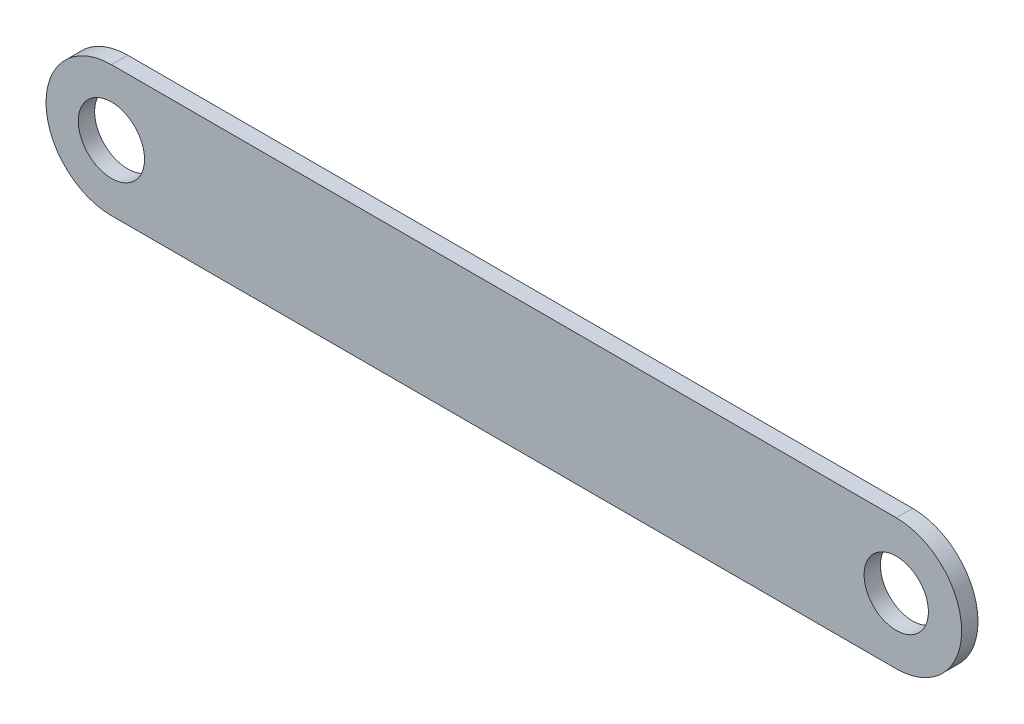
ISO-10303-21;
HEADER;
FILE_DESCRIPTION(('STEP AP214'),'2;1');
FILE_NAME('part.step','',(''),(''),'','','');
FILE_SCHEMA(('AUTOMOTIVE_DESIGN { 1 0 10303 214 1 1 1 1 }'));
ENDSEC;
DATA;
#1=APPLICATION_CONTEXT('core data for automotive mechanical design processes');
#2=APPLICATION_PROTOCOL_DEFINITION('international standard','automotive_design',2000,#1);
#3=PRODUCT_CONTEXT('',#1,'mechanical');
#4=PRODUCT('Part','Part','',(#3));
#5=PRODUCT_RELATED_PRODUCT_CATEGORY('part','',(#4));
#6=PRODUCT_DEFINITION_FORMATION('','',#4);
#7=PRODUCT_DEFINITION_CONTEXT('part definition',#1,'design');
#8=PRODUCT_DEFINITION('design','',#6,#7);
#9=PRODUCT_DEFINITION_SHAPE('','',#8);
#10=(LENGTH_UNIT() NAMED_UNIT(*) SI_UNIT(.MILLI.,.METRE.));
#11=(NAMED_UNIT(*) PLANE_ANGLE_UNIT() SI_UNIT($,.RADIAN.));
#12=(NAMED_UNIT(*) SI_UNIT($,.STERADIAN.) SOLID_ANGLE_UNIT());
#13=UNCERTAINTY_MEASURE_WITH_UNIT(LENGTH_MEASURE(1.E-05),#10,'distance_accuracy_value','');
#14=(GEOMETRIC_REPRESENTATION_CONTEXT(3) GLOBAL_UNCERTAINTY_ASSIGNED_CONTEXT((#13)) GLOBAL_UNIT_ASSIGNED_CONTEXT((#10,
#11,#12)) REPRESENTATION_CONTEXT('',''));
#15=CARTESIAN_POINT('',(0.,0.,0.));
#16=DIRECTION('',(0.,0.,1.));
#17=DIRECTION('',(1.,0.,0.));
#18=AXIS2_PLACEMENT_3D('',#15,#16,#17);
#19=CARTESIAN_POINT('',(0.,-12.7,3.175));
#20=DIRECTION('',(0.,1.,0.));
#21=DIRECTION('',(0.,0.,1.));
#22=AXIS2_PLACEMENT_3D('',#19,#20,#21);
#23=PLANE('',#22);
#24=DIRECTION('',(1.,0.,0.));
#25=VECTOR('',#24,1.);
#26=CARTESIAN_POINT('',(0.,-12.7,0.));
#27=LINE('',#26,#25);
#28=CARTESIAN_POINT('',(0.,-12.7,0.));
#29=VERTEX_POINT('',#28);
#30=CARTESIAN_POINT('',(152.4,-12.7,0.));
#31=VERTEX_POINT('',#30);
#32=EDGE_CURVE('E104',#29,#31,#27,.T.);
#33=ORIENTED_EDGE('',*,*,#32,.T.);
#34=DIRECTION('',(0.,0.,-1.));
#35=VECTOR('',#34,1.);
#36=CARTESIAN_POINT('',(152.4,-12.7,3.175));
#37=LINE('',#36,#35);
#38=CARTESIAN_POINT('',(152.4,-12.7,3.175));
#39=VERTEX_POINT('',#38);
#40=EDGE_CURVE('E11',#39,#31,#37,.T.);
#41=ORIENTED_EDGE('',*,*,#40,.F.);
#42=DIRECTION('',(1.,0.,0.));
#43=VECTOR('',#42,1.);
#44=CARTESIAN_POINT('',(0.,-12.7,3.175));
#45=LINE('',#44,#43);
#46=CARTESIAN_POINT('',(0.,-12.7,3.175));
#47=VERTEX_POINT('',#46);
#48=EDGE_CURVE('E83',#47,#39,#45,.T.);
#49=ORIENTED_EDGE('',*,*,#48,.F.);
#50=DIRECTION('',(0.,0.,-1.));
#51=VECTOR('',#50,1.);
#52=CARTESIAN_POINT('',(0.,-12.7,3.175));
#53=LINE('',#52,#51);
#54=EDGE_CURVE('E94',#47,#29,#53,.T.);
#55=ORIENTED_EDGE('',*,*,#54,.T.);
#56=EDGE_LOOP('',(#33,#41,#49,#55));
#57=FACE_BOUND('',#56,.T.);
#58=ADVANCED_FACE('F35',(#57),#23,.F.);
#59=CARTESIAN_POINT('',(152.4,0.,3.175));
#60=DIRECTION('',(0.,0.,-1.));
#61=DIRECTION('',(-1.,0.,0.));
#62=AXIS2_PLACEMENT_3D('',#59,#60,#61);
#63=CYLINDRICAL_SURFACE('',#62,12.7);
#64=CARTESIAN_POINT('',(152.4,0.,0.));
#65=DIRECTION('',(0.,0.,1.));
#66=DIRECTION('',(1.,0.,0.));
#67=AXIS2_PLACEMENT_3D('',#64,#65,#66);
#68=CIRCLE('',#67,12.7);
#69=CARTESIAN_POINT('',(152.4,12.7,0.));
#70=VERTEX_POINT('',#69);
#71=EDGE_CURVE('E88',#31,#70,#68,.T.);
#72=ORIENTED_EDGE('',*,*,#71,.T.);
#73=DIRECTION('',(0.,0.,-1.));
#74=VECTOR('',#73,1.);
#75=CARTESIAN_POINT('',(152.4,12.7,3.175));
#76=LINE('',#75,#74);
#77=CARTESIAN_POINT('',(152.4,12.7,3.175));
#78=VERTEX_POINT('',#77);
#79=EDGE_CURVE('E44',#78,#70,#76,.T.);
#80=ORIENTED_EDGE('',*,*,#79,.F.);
#81=CARTESIAN_POINT('',(152.4,0.,3.175));
#82=DIRECTION('',(0.,0.,1.));
#83=DIRECTION('',(1.,0.,0.));
#84=AXIS2_PLACEMENT_3D('',#81,#82,#83);
#85=CIRCLE('',#84,12.7);
#86=EDGE_CURVE('E78',#39,#78,#85,.T.);
#87=ORIENTED_EDGE('',*,*,#86,.F.);
#88=ORIENTED_EDGE('',*,*,#40,.T.);
#89=EDGE_LOOP('',(#72,#80,#87,#88));
#90=FACE_BOUND('',#89,.T.);
#91=ADVANCED_FACE('F87',(#90),#63,.T.);
#92=CARTESIAN_POINT('',(0.,12.7,3.175));
#93=DIRECTION('',(0.,1.,0.));
#94=DIRECTION('',(0.,0.,1.));
#95=AXIS2_PLACEMENT_3D('',#92,#93,#94);
#96=PLANE('',#95);
#97=DIRECTION('',(1.,0.,0.));
#98=VECTOR('',#97,1.);
#99=CARTESIAN_POINT('',(0.,12.7,0.));
#100=LINE('',#99,#98);
#101=CARTESIAN_POINT('',(0.,12.7,0.));
#102=VERTEX_POINT('',#101);
#103=EDGE_CURVE('E108',#102,#70,#100,.T.);
#104=ORIENTED_EDGE('',*,*,#103,.F.);
#105=DIRECTION('',(0.,0.,-1.));
#106=VECTOR('',#105,1.);
#107=CARTESIAN_POINT('',(0.,12.7,3.175));
#108=LINE('',#107,#106);
#109=CARTESIAN_POINT('',(0.,12.7,3.175));
#110=VERTEX_POINT('',#109);
#111=EDGE_CURVE('E68',#110,#102,#108,.T.);
#112=ORIENTED_EDGE('',*,*,#111,.F.);
#113=DIRECTION('',(1.,0.,0.));
#114=VECTOR('',#113,1.);
#115=CARTESIAN_POINT('',(0.,12.7,3.175));
#116=LINE('',#115,#114);
#117=EDGE_CURVE('E81',#110,#78,#116,.T.);
#118=ORIENTED_EDGE('',*,*,#117,.T.);
#119=ORIENTED_EDGE('',*,*,#79,.T.);
#120=EDGE_LOOP('',(#104,#112,#118,#119));
#121=FACE_BOUND('',#120,.T.);
#122=ADVANCED_FACE('F92',(#121),#96,.T.);
#123=CARTESIAN_POINT('',(0.,0.,3.175));
#124=DIRECTION('',(0.,0.,-1.));
#125=DIRECTION('',(-1.,0.,0.));
#126=AXIS2_PLACEMENT_3D('',#123,#124,#125);
#127=CYLINDRICAL_SURFACE('',#126,6.43006976920332);
#128=CARTESIAN_POINT('',(0.,0.,3.175));
#129=DIRECTION('',(0.,0.,1.));
#130=DIRECTION('',(1.,0.,0.));
#131=AXIS2_PLACEMENT_3D('',#128,#129,#130);
#132=CIRCLE('',#131,6.43006976920332);
#133=CARTESIAN_POINT('',(6.43006976920332,0.,3.175));
#134=VERTEX_POINT('',#133);
#135=EDGE_CURVE('E146',#134,#134,#132,.T.);
#136=ORIENTED_EDGE('',*,*,#135,.T.);
#137=EDGE_LOOP('',(#136));
#138=FACE_BOUND('',#137,.T.);
#139=CARTESIAN_POINT('',(0.,0.,0.));
#140=DIRECTION('',(0.,0.,1.));
#141=DIRECTION('',(1.,0.,0.));
#142=AXIS2_PLACEMENT_3D('',#139,#140,#141);
#143=CIRCLE('',#142,6.43006976920332);
#144=CARTESIAN_POINT('',(6.43006976920332,0.,0.));
#145=VERTEX_POINT('',#144);
#146=EDGE_CURVE('E101',#145,#145,#143,.T.);
#147=ORIENTED_EDGE('',*,*,#146,.F.);
#148=EDGE_LOOP('',(#147));
#149=FACE_BOUND('',#148,.T.);
#150=ADVANCED_FACE('F135',(#138,#149),#127,.F.);
#151=CARTESIAN_POINT('',(152.4,0.,3.175));
#152=DIRECTION('',(0.,0.,-1.));
#153=DIRECTION('',(-1.,0.,0.));
#154=AXIS2_PLACEMENT_3D('',#151,#152,#153);
#155=CYLINDRICAL_SURFACE('',#154,6.24775672436994);
#156=CARTESIAN_POINT('',(152.4,0.,3.175));
#157=DIRECTION('',(0.,0.,1.));
#158=DIRECTION('',(1.,0.,0.));
#159=AXIS2_PLACEMENT_3D('',#156,#157,#158);
#160=CIRCLE('',#159,6.24775672436994);
#161=CARTESIAN_POINT('',(158.64775672437,0.,3.175));
#162=VERTEX_POINT('',#161);
#163=EDGE_CURVE('E111',#162,#162,#160,.T.);
#164=ORIENTED_EDGE('',*,*,#163,.T.);
#165=EDGE_LOOP('',(#164));
#166=FACE_BOUND('',#165,.T.);
#167=CARTESIAN_POINT('',(152.4,0.,0.));
#168=DIRECTION('',(0.,0.,1.));
#169=DIRECTION('',(1.,0.,0.));
#170=AXIS2_PLACEMENT_3D('',#167,#168,#169);
#171=CIRCLE('',#170,6.24775672436994);
#172=CARTESIAN_POINT('',(158.64775672437,0.,0.));
#173=VERTEX_POINT('',#172);
#174=EDGE_CURVE('E98',#173,#173,#171,.T.);
#175=ORIENTED_EDGE('',*,*,#174,.F.);
#176=EDGE_LOOP('',(#175));
#177=FACE_BOUND('',#176,.T.);
#178=ADVANCED_FACE('F37',(#166,#177),#155,.F.);
#179=CARTESIAN_POINT('',(0.,0.,3.175));
#180=DIRECTION('',(0.,0.,-1.));
#181=DIRECTION('',(-1.,0.,0.));
#182=AXIS2_PLACEMENT_3D('',#179,#180,#181);
#183=CYLINDRICAL_SURFACE('',#182,12.7);
#184=CARTESIAN_POINT('',(0.,0.,0.));
#185=DIRECTION('',(0.,0.,1.));
#186=DIRECTION('',(1.,0.,0.));
#187=AXIS2_PLACEMENT_3D('',#184,#185,#186);
#188=CIRCLE('',#187,12.7);
#189=EDGE_CURVE('E71',#102,#29,#188,.T.);
#190=ORIENTED_EDGE('',*,*,#189,.T.);
#191=ORIENTED_EDGE('',*,*,#54,.F.);
#192=CARTESIAN_POINT('',(0.,0.,3.175));
#193=DIRECTION('',(0.,0.,1.));
#194=DIRECTION('',(1.,0.,0.));
#195=AXIS2_PLACEMENT_3D('',#192,#193,#194);
#196=CIRCLE('',#195,12.7);
#197=EDGE_CURVE('E52',#110,#47,#196,.T.);
#198=ORIENTED_EDGE('',*,*,#197,.F.);
#199=ORIENTED_EDGE('',*,*,#111,.T.);
#200=EDGE_LOOP('',(#190,#191,#198,#199));
#201=FACE_BOUND('',#200,.T.);
#202=ADVANCED_FACE('F123',(#201),#183,.T.);
#203=CARTESIAN_POINT('',(0.,0.,3.175));
#204=DIRECTION('',(0.,0.,1.));
#205=DIRECTION('',(1.,0.,0.));
#206=AXIS2_PLACEMENT_3D('',#203,#204,#205);
#207=PLANE('',#206);
#208=ORIENTED_EDGE('',*,*,#163,.F.);
#209=EDGE_LOOP('',(#208));
#210=FACE_BOUND('',#209,.T.);
#211=ORIENTED_EDGE('',*,*,#135,.F.);
#212=EDGE_LOOP('',(#211));
#213=FACE_BOUND('',#212,.T.);
#214=ORIENTED_EDGE('',*,*,#48,.T.);
#215=ORIENTED_EDGE('',*,*,#86,.T.);
#216=ORIENTED_EDGE('',*,*,#117,.F.);
#217=ORIENTED_EDGE('',*,*,#197,.T.);
#218=EDGE_LOOP('',(#214,#215,#216,#217));
#219=FACE_BOUND('',#218,.T.);
#220=ADVANCED_FACE('F79',(#210,#213,#219),#207,.T.);
#221=CARTESIAN_POINT('',(0.,0.,0.));
#222=DIRECTION('',(0.,0.,1.));
#223=DIRECTION('',(1.,0.,0.));
#224=AXIS2_PLACEMENT_3D('',#221,#222,#223);
#225=PLANE('',#224);
#226=ORIENTED_EDGE('',*,*,#174,.T.);
#227=EDGE_LOOP('',(#226));
#228=FACE_BOUND('',#227,.T.);
#229=ORIENTED_EDGE('',*,*,#146,.T.);
#230=EDGE_LOOP('',(#229));
#231=FACE_BOUND('',#230,.T.);
#232=ORIENTED_EDGE('',*,*,#32,.F.);
#233=ORIENTED_EDGE('',*,*,#189,.F.);
#234=ORIENTED_EDGE('',*,*,#103,.T.);
#235=ORIENTED_EDGE('',*,*,#71,.F.);
#236=EDGE_LOOP('',(#232,#233,#234,#235));
#237=FACE_BOUND('',#236,.T.);
#238=ADVANCED_FACE('F116',(#228,#231,#237),#225,.F.);
#239=CLOSED_SHELL('',(#58,#91,#122,#150,#178,#202,#220,#238));
#240=MANIFOLD_SOLID_BREP('B2',#239);
#241=ADVANCED_BREP_SHAPE_REPRESENTATION('',(#18,#240),#14);
#242=SHAPE_DEFINITION_REPRESENTATION(#9,#241);
ENDSEC;
END-ISO-10303-21;
